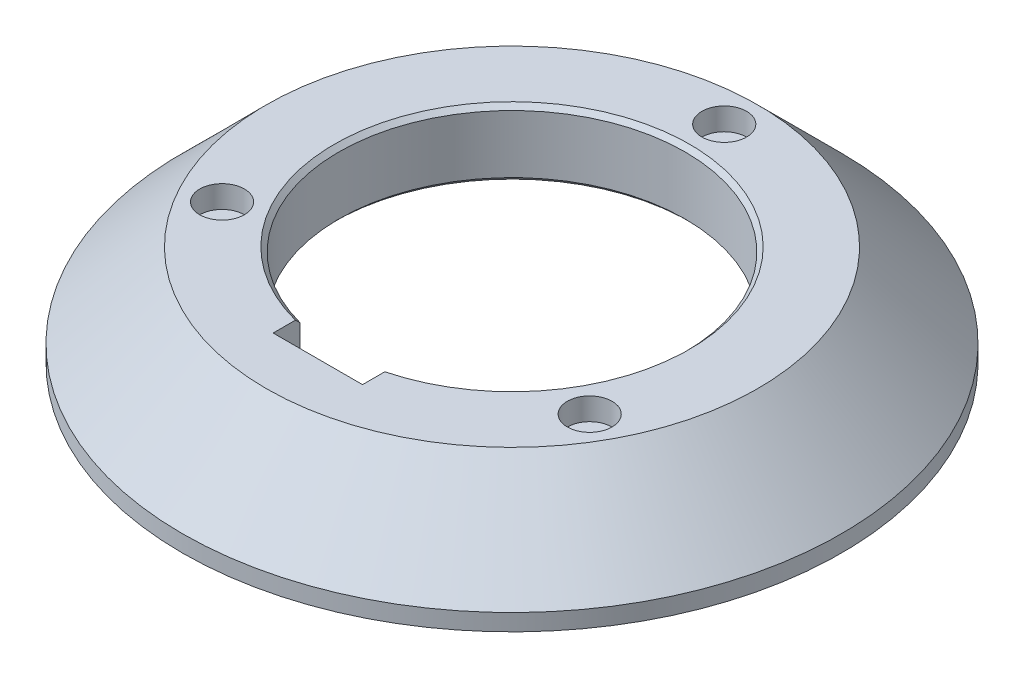
ISO-10303-21;
HEADER;
FILE_DESCRIPTION(('STEP AP214'),'2;1');
FILE_NAME('part.step','',(''),(''),'','','');
FILE_SCHEMA(('AUTOMOTIVE_DESIGN { 1 0 10303 214 1 1 1 1 }'));
ENDSEC;
DATA;
#1=APPLICATION_CONTEXT('core data for automotive mechanical design processes');
#2=APPLICATION_PROTOCOL_DEFINITION('international standard','automotive_design',2000,#1);
#3=PRODUCT_CONTEXT('',#1,'mechanical');
#4=PRODUCT('Part','Part','',(#3));
#5=PRODUCT_RELATED_PRODUCT_CATEGORY('part','',(#4));
#6=PRODUCT_DEFINITION_FORMATION('','',#4);
#7=PRODUCT_DEFINITION_CONTEXT('part definition',#1,'design');
#8=PRODUCT_DEFINITION('design','',#6,#7);
#9=PRODUCT_DEFINITION_SHAPE('','',#8);
#10=(LENGTH_UNIT() NAMED_UNIT(*) SI_UNIT(.MILLI.,.METRE.));
#11=(NAMED_UNIT(*) PLANE_ANGLE_UNIT() SI_UNIT($,.RADIAN.));
#12=(NAMED_UNIT(*) SI_UNIT($,.STERADIAN.) SOLID_ANGLE_UNIT());
#13=UNCERTAINTY_MEASURE_WITH_UNIT(LENGTH_MEASURE(1.E-05),#10,'distance_accuracy_value','');
#14=(GEOMETRIC_REPRESENTATION_CONTEXT(3) GLOBAL_UNCERTAINTY_ASSIGNED_CONTEXT((#13)) GLOBAL_UNIT_ASSIGNED_CONTEXT((#10,
#11,#12)) REPRESENTATION_CONTEXT('',''));
#15=CARTESIAN_POINT('',(0.,0.,0.));
#16=DIRECTION('',(0.,0.,1.));
#17=DIRECTION('',(1.,0.,0.));
#18=AXIS2_PLACEMENT_3D('',#15,#16,#17);
#19=CARTESIAN_POINT('',(110.,30.,0.));
#20=DIRECTION('',(0.,-1.,0.));
#21=DIRECTION('',(0.,0.,-1.));
#22=AXIS2_PLACEMENT_3D('',#19,#20,#21);
#23=PLANE('',#22);
#24=CARTESIAN_POINT('',(-82.2724133595215,30.,47.5000000000004));
#25=DIRECTION('',(0.,1.,0.));
#26=DIRECTION('',(0.866025403784436,0.,-0.500000000000004));
#27=AXIS2_PLACEMENT_3D('',#24,#25,#26);
#28=CIRCLE('',#27,10.);
#29=CARTESIAN_POINT('',(-73.6121593216771,30.,42.5000000000003));
#30=VERTEX_POINT('',#29);
#31=EDGE_CURVE('E131',#30,#30,#28,.T.);
#32=ORIENTED_EDGE('',*,*,#31,.F.);
#33=EDGE_LOOP('',(#32));
#34=FACE_BOUND('',#33,.T.);
#35=CARTESIAN_POINT('',(82.2724133595221,30.,47.4999999999992));
#36=DIRECTION('',(0.,1.,0.));
#37=DIRECTION('',(-0.866025403784443,0.,-0.499999999999992));
#38=AXIS2_PLACEMENT_3D('',#35,#36,#37);
#39=CIRCLE('',#38,10.);
#40=CARTESIAN_POINT('',(73.6121593216777,30.,42.4999999999993));
#41=VERTEX_POINT('',#40);
#42=EDGE_CURVE('E116',#41,#41,#39,.T.);
#43=ORIENTED_EDGE('',*,*,#42,.F.);
#44=EDGE_LOOP('',(#43));
#45=FACE_BOUND('',#44,.T.);
#46=CARTESIAN_POINT('',(0.,30.,-95.));
#47=DIRECTION('',(0.,1.,0.));
#48=DIRECTION('',(0.,0.,1.));
#49=AXIS2_PLACEMENT_3D('',#46,#47,#48);
#50=CIRCLE('',#49,10.);
#51=CARTESIAN_POINT('',(0.,30.,-85.));
#52=VERTEX_POINT('',#51);
#53=EDGE_CURVE('E130',#52,#52,#50,.T.);
#54=ORIENTED_EDGE('',*,*,#53,.F.);
#55=EDGE_LOOP('',(#54));
#56=FACE_BOUND('',#55,.T.);
#57=DIRECTION('',(-1.,0.,0.));
#58=VECTOR('',#57,1.);
#59=CARTESIAN_POINT('',(110.,30.,86.9));
#60=LINE('',#59,#58);
#61=CARTESIAN_POINT('',(20.,30.,86.9));
#62=VERTEX_POINT('',#61);
#63=CARTESIAN_POINT('',(-20.,30.,86.9));
#64=VERTEX_POINT('',#63);
#65=EDGE_CURVE('E107',#62,#64,#60,.T.);
#66=ORIENTED_EDGE('',*,*,#65,.T.);
#67=DIRECTION('',(0.,0.,-1.));
#68=VECTOR('',#67,1.);
#69=CARTESIAN_POINT('',(-20.,30.,0.));
#70=LINE('',#69,#68);
#71=CARTESIAN_POINT('',(-19.999999183372,30.0000087539034,76.943165574341));
#72=VERTEX_POINT('',#71);
#73=EDGE_CURVE('E118',#64,#72,#70,.T.);
#74=ORIENTED_EDGE('',*,*,#73,.T.);
#75=CARTESIAN_POINT('',(0.,30.,0.));
#76=DIRECTION('',(0.,-1.,0.));
#77=DIRECTION('',(0.,0.,-1.));
#78=AXIS2_PLACEMENT_3D('',#75,#76,#77);
#79=CIRCLE('',#78,79.5);
#80=CARTESIAN_POINT('',(19.9999991833721,30.0000087539034,76.943165574341));
#81=VERTEX_POINT('',#80);
#82=EDGE_CURVE('E166',#72,#81,#79,.T.);
#83=ORIENTED_EDGE('',*,*,#82,.T.);
#84=DIRECTION('',(0.,0.,1.));
#85=VECTOR('',#84,1.);
#86=CARTESIAN_POINT('',(20.,30.,0.));
#87=LINE('',#86,#85);
#88=EDGE_CURVE('E54',#81,#62,#87,.T.);
#89=ORIENTED_EDGE('',*,*,#88,.T.);
#90=EDGE_LOOP('',(#66,#74,#83,#89));
#91=FACE_BOUND('',#90,.T.);
#92=CARTESIAN_POINT('',(0.,30.,0.));
#93=DIRECTION('',(0.,1.,0.));
#94=DIRECTION('',(0.,0.,1.));
#95=AXIS2_PLACEMENT_3D('',#92,#93,#94);
#96=CIRCLE('',#95,110.);
#97=CARTESIAN_POINT('',(0.,30.,110.));
#98=VERTEX_POINT('',#97);
#99=EDGE_CURVE('E142',#98,#98,#96,.T.);
#100=ORIENTED_EDGE('',*,*,#99,.T.);
#101=EDGE_LOOP('',(#100));
#102=FACE_BOUND('',#101,.T.);
#103=ADVANCED_FACE('F37',(#34,#45,#56,#91,#102),#23,.F.);
#104=CARTESIAN_POINT('',(0.,107.750556792873,0.));
#105=DIRECTION('',(0.,1.,0.));
#106=DIRECTION('',(0.,0.,1.));
#107=AXIS2_PLACEMENT_3D('',#104,#105,#106);
#108=CYLINDRICAL_SURFACE('',#107,77.5);
#109=CARTESIAN_POINT('',(0.,28.,0.));
#110=DIRECTION('',(0.,-1.,0.));
#111=DIRECTION('',(0.,0.,-1.));
#112=AXIS2_PLACEMENT_3D('',#109,#110,#111);
#113=CIRCLE('',#112,77.5);
#114=CARTESIAN_POINT('',(20.,28.,74.8748956593597));
#115=VERTEX_POINT('',#114);
#116=CARTESIAN_POINT('',(-20.,28.,74.8748956593597));
#117=VERTEX_POINT('',#116);
#118=EDGE_CURVE('E160',#115,#117,#113,.F.);
#119=ORIENTED_EDGE('',*,*,#118,.T.);
#120=DIRECTION('',(0.,1.,0.));
#121=VECTOR('',#120,1.);
#122=CARTESIAN_POINT('',(-20.,107.750556792873,74.8748956593597));
#123=LINE('',#122,#121);
#124=CARTESIAN_POINT('',(-20.,2.00000000000003,74.8748956593597));
#125=VERTEX_POINT('',#124);
#126=EDGE_CURVE('E101',#117,#125,#123,.F.);
#127=ORIENTED_EDGE('',*,*,#126,.T.);
#128=CARTESIAN_POINT('',(0.,2.00000000000003,0.));
#129=DIRECTION('',(0.,1.,0.));
#130=DIRECTION('',(0.,0.,1.));
#131=AXIS2_PLACEMENT_3D('',#128,#129,#130);
#132=CIRCLE('',#131,77.5);
#133=CARTESIAN_POINT('',(20.,2.00000000000003,74.8748956593597));
#134=VERTEX_POINT('',#133);
#135=EDGE_CURVE('E163',#125,#134,#132,.F.);
#136=ORIENTED_EDGE('',*,*,#135,.T.);
#137=DIRECTION('',(0.,1.,0.));
#138=VECTOR('',#137,1.);
#139=CARTESIAN_POINT('',(20.,107.750556792873,74.8748956593597));
#140=LINE('',#139,#138);
#141=EDGE_CURVE('E108',#134,#115,#140,.T.);
#142=ORIENTED_EDGE('',*,*,#141,.T.);
#143=EDGE_LOOP('',(#119,#127,#136,#142));
#144=FACE_BOUND('',#143,.T.);
#145=ADVANCED_FACE('F206',(#144),#108,.F.);
#146=CARTESIAN_POINT('',(77.5,0.,0.));
#147=DIRECTION('',(0.,1.,0.));
#148=DIRECTION('',(0.,0.,1.));
#149=AXIS2_PLACEMENT_3D('',#146,#147,#148);
#150=PLANE('',#149);
#151=CARTESIAN_POINT('',(0.,0.,0.));
#152=DIRECTION('',(0.,1.,0.));
#153=DIRECTION('',(0.,0.,1.));
#154=AXIS2_PLACEMENT_3D('',#151,#152,#153);
#155=CIRCLE('',#154,79.5);
#156=CARTESIAN_POINT('',(20.,0.,76.9431608396744));
#157=VERTEX_POINT('',#156);
#158=CARTESIAN_POINT('',(-20.,0.,76.9431608396744));
#159=VERTEX_POINT('',#158);
#160=EDGE_CURVE('E113',#157,#159,#155,.T.);
#161=ORIENTED_EDGE('',*,*,#160,.T.);
#162=DIRECTION('',(0.,0.,1.));
#163=VECTOR('',#162,1.);
#164=CARTESIAN_POINT('',(-20.,0.,0.));
#165=LINE('',#164,#163);
#166=CARTESIAN_POINT('',(-20.,0.,86.9));
#167=VERTEX_POINT('',#166);
#168=EDGE_CURVE('E62',#159,#167,#165,.T.);
#169=ORIENTED_EDGE('',*,*,#168,.T.);
#170=DIRECTION('',(1.,0.,0.));
#171=VECTOR('',#170,1.);
#172=CARTESIAN_POINT('',(77.5,0.,86.9));
#173=LINE('',#172,#171);
#174=CARTESIAN_POINT('',(20.,0.,86.9));
#175=VERTEX_POINT('',#174);
#176=EDGE_CURVE('E11',#167,#175,#173,.T.);
#177=ORIENTED_EDGE('',*,*,#176,.T.);
#178=DIRECTION('',(0.,0.,-1.));
#179=VECTOR('',#178,1.);
#180=CARTESIAN_POINT('',(20.,0.,0.));
#181=LINE('',#180,#179);
#182=EDGE_CURVE('E92',#175,#157,#181,.T.);
#183=ORIENTED_EDGE('',*,*,#182,.T.);
#184=EDGE_LOOP('',(#161,#169,#177,#183));
#185=FACE_BOUND('',#184,.T.);
#186=CARTESIAN_POINT('',(0.,0.,0.));
#187=DIRECTION('',(0.,1.,0.));
#188=DIRECTION('',(0.,0.,1.));
#189=AXIS2_PLACEMENT_3D('',#186,#187,#188);
#190=CIRCLE('',#189,117.5);
#191=CARTESIAN_POINT('',(0.,0.,117.5));
#192=VERTEX_POINT('',#191);
#193=EDGE_CURVE('E156',#192,#192,#190,.T.);
#194=ORIENTED_EDGE('',*,*,#193,.F.);
#195=EDGE_LOOP('',(#194));
#196=FACE_BOUND('',#195,.T.);
#197=ADVANCED_FACE('F111',(#185,#196),#150,.F.);
#198=CARTESIAN_POINT('',(0.,0.,0.));
#199=DIRECTION('',(0.,-1.,0.));
#200=DIRECTION('',(0.,0.,-1.));
#201=AXIS2_PLACEMENT_3D('',#198,#199,#200);
#202=CONICAL_SURFACE('',#201,117.5,0.785398163397447);
#203=CARTESIAN_POINT('',(0.,-15.,0.));
#204=DIRECTION('',(0.,1.,0.));
#205=DIRECTION('',(0.,0.,1.));
#206=AXIS2_PLACEMENT_3D('',#203,#204,#205);
#207=CIRCLE('',#206,132.5);
#208=CARTESIAN_POINT('',(0.,-15.,132.5));
#209=VERTEX_POINT('',#208);
#210=EDGE_CURVE('E153',#209,#209,#207,.T.);
#211=ORIENTED_EDGE('',*,*,#210,.F.);
#212=EDGE_LOOP('',(#211));
#213=FACE_BOUND('',#212,.T.);
#214=ORIENTED_EDGE('',*,*,#193,.T.);
#215=EDGE_LOOP('',(#214));
#216=FACE_BOUND('',#215,.T.);
#217=ADVANCED_FACE('F213',(#213,#216),#202,.F.);
#218=CARTESIAN_POINT('',(132.5,-15.,0.));
#219=DIRECTION('',(0.,1.,0.));
#220=DIRECTION('',(0.,0.,1.));
#221=AXIS2_PLACEMENT_3D('',#218,#219,#220);
#222=PLANE('',#221);
#223=CARTESIAN_POINT('',(0.,-15.,0.));
#224=DIRECTION('',(0.,1.,0.));
#225=DIRECTION('',(0.,0.,1.));
#226=AXIS2_PLACEMENT_3D('',#223,#224,#225);
#227=CIRCLE('',#226,147.5);
#228=CARTESIAN_POINT('',(0.,-15.,147.5));
#229=VERTEX_POINT('',#228);
#230=EDGE_CURVE('E150',#229,#229,#227,.T.);
#231=ORIENTED_EDGE('',*,*,#230,.F.);
#232=EDGE_LOOP('',(#231));
#233=FACE_BOUND('',#232,.T.);
#234=ORIENTED_EDGE('',*,*,#210,.T.);
#235=EDGE_LOOP('',(#234));
#236=FACE_BOUND('',#235,.T.);
#237=ADVANCED_FACE('F216',(#233,#236),#222,.F.);
#238=CARTESIAN_POINT('',(0.,107.750556792873,0.));
#239=DIRECTION('',(0.,1.,0.));
#240=DIRECTION('',(0.,0.,1.));
#241=AXIS2_PLACEMENT_3D('',#238,#239,#240);
#242=CYLINDRICAL_SURFACE('',#241,147.5);
#243=CARTESIAN_POINT('',(0.,-7.5000000000001,0.));
#244=DIRECTION('',(0.,1.,0.));
#245=DIRECTION('',(0.,0.,1.));
#246=AXIS2_PLACEMENT_3D('',#243,#244,#245);
#247=CIRCLE('',#246,147.5);
#248=CARTESIAN_POINT('',(0.,-7.5000000000001,147.5));
#249=VERTEX_POINT('',#248);
#250=EDGE_CURVE('E147',#249,#249,#247,.T.);
#251=ORIENTED_EDGE('',*,*,#250,.F.);
#252=EDGE_LOOP('',(#251));
#253=FACE_BOUND('',#252,.T.);
#254=ORIENTED_EDGE('',*,*,#230,.T.);
#255=EDGE_LOOP('',(#254));
#256=FACE_BOUND('',#255,.T.);
#257=ADVANCED_FACE('F220',(#253,#256),#242,.T.);
#258=CARTESIAN_POINT('',(0.,-7.5000000000001,0.));
#259=DIRECTION('',(0.,-1.,0.));
#260=DIRECTION('',(0.,0.,-1.));
#261=AXIS2_PLACEMENT_3D('',#258,#259,#260);
#262=CONICAL_SURFACE('',#261,147.5,0.785398163397447);
#263=ORIENTED_EDGE('',*,*,#99,.F.);
#264=EDGE_LOOP('',(#263));
#265=FACE_BOUND('',#264,.T.);
#266=ORIENTED_EDGE('',*,*,#250,.T.);
#267=EDGE_LOOP('',(#266));
#268=FACE_BOUND('',#267,.T.);
#269=ADVANCED_FACE('F201',(#265,#268),#262,.T.);
#270=CARTESIAN_POINT('',(0.,0.,0.));
#271=DIRECTION('',(0.,-1.,0.));
#272=DIRECTION('',(0.,0.,-1.));
#273=AXIS2_PLACEMENT_3D('',#270,#271,#272);
#274=CONICAL_SURFACE('',#273,79.5,0.785398163397441);
#275=CARTESIAN_POINT('',(-20.,-17.5684312119772,94.9856849106975));
#276=CARTESIAN_POINT('',(-20.,-16.0097924913469,93.3928472974872));
#277=CARTESIAN_POINT('',(-20.,-14.4519817757735,91.7991986225075));
#278=CARTESIAN_POINT('',(-20.,-11.3383457901811,88.6099617932942));
#279=CARTESIAN_POINT('',(-20.,-9.78252052094745,87.0143736382942));
#280=CARTESIAN_POINT('',(-20.,-6.67321620346296,83.8209726736292));
#281=CARTESIAN_POINT('',(-20.,-5.11973711035972,82.2231599076445));
#282=CARTESIAN_POINT('',(-20.,-2.01552747081061,79.02486686309));
#283=CARTESIAN_POINT('',(-20.,-0.4647969237774,77.4243865850903));
#284=CARTESIAN_POINT('',(-20.,2.63339750207828,74.2202237529315));
#285=CARTESIAN_POINT('',(-20.,4.18086133553764,72.6165411548974));
#286=CARTESIAN_POINT('',(-20.,7.271804411606,69.4053439372526));
#287=CARTESIAN_POINT('',(-20.,8.81528365975796,67.7978293229788));
#288=CARTESIAN_POINT('',(-20.,11.8973897349149,64.5780925799859));
#289=CARTESIAN_POINT('',(-20.,13.4360164677237,62.9658703610395));
#290=CARTESIAN_POINT('',(-20.,15.7393910224165,60.5431891470597));
#291=CARTESIAN_POINT('',(-20.,16.5064234991292,59.7349020997113));
#292=CARTESIAN_POINT('',(-20.,18.0387677175682,58.1166970803101));
#293=CARTESIAN_POINT('',(-20.,18.8040794574747,57.3067791065341));
#294=CARTESIAN_POINT('',(-20.,19.5684312119773,56.49595505338));
#295=B_SPLINE_CURVE_WITH_KNOTS('',3,(#275,#276,#277,#278,#279,#280,#281,#282,#283,#284,#285,
#286,#287,#288,#289,#290,#291,#292,#293,#294),.UNSPECIFIED.,.F.,.F.,(4,2,2,2,2,2,2,2,2,4),(0.,
6.68568506223245,13.3713727677386,20.0569310011246,26.742487805724,33.4281368463093,
40.1137765814846,46.7995453080812,50.1424461297198,53.4853504850127),.UNSPECIFIED.);
#296=EDGE_CURVE('E114',#159,#125,#295,.T.);
#297=ORIENTED_EDGE('',*,*,#296,.F.);
#298=ORIENTED_EDGE('',*,*,#160,.F.);
#299=CARTESIAN_POINT('',(20.,19.5684312119773,56.49595505338));
#300=CARTESIAN_POINT('',(20.,18.8040794574747,57.3067791065341));
#301=CARTESIAN_POINT('',(20.,18.0387677175682,58.11669708031));
#302=CARTESIAN_POINT('',(20.,16.5064234991293,59.7349020997113));
#303=CARTESIAN_POINT('',(20.,15.7393910224165,60.5431891470597));
#304=CARTESIAN_POINT('',(20.,13.4360164677237,62.9658703610395));
#305=CARTESIAN_POINT('',(20.,11.8973897349149,64.5780925799859));
#306=CARTESIAN_POINT('',(20.,8.81528365975795,67.7978293229788));
#307=CARTESIAN_POINT('',(20.,7.27180441160599,69.4053439372526));
#308=CARTESIAN_POINT('',(20.,4.18086133553762,72.6165411548974));
#309=CARTESIAN_POINT('',(20.,2.63339750207826,74.2202237529315));
#310=CARTESIAN_POINT('',(20.,-0.464796923777415,77.4243865850904));
#311=CARTESIAN_POINT('',(20.,-2.01552747081062,79.02486686309));
#312=CARTESIAN_POINT('',(20.,-5.11973711035974,82.2231599076445));
#313=CARTESIAN_POINT('',(20.,-6.67321620346298,83.8209726736293));
#314=CARTESIAN_POINT('',(20.,-9.78252052094747,87.0143736382942));
#315=CARTESIAN_POINT('',(20.,-11.3383457901812,88.6099617932942));
#316=CARTESIAN_POINT('',(20.,-14.4519817757735,91.7991986225075));
#317=CARTESIAN_POINT('',(20.,-16.0097924913469,93.3928472974872));
#318=CARTESIAN_POINT('',(20.,-17.5684312119773,94.9856849106975));
#319=B_SPLINE_CURVE_WITH_KNOTS('',3,(#299,#300,#301,#302,#303,#304,#305,#306,#307,#308,#309,
#310,#311,#312,#313,#314,#315,#316,#317,#318),.UNSPECIFIED.,.F.,.F.,(4,2,2,2,2,2,2,2,2,4),(0.,
3.34290435529286,6.68580517693152,13.3715739035281,20.0572136387034,26.7428626792887,
33.4284194838881,40.1139777172742,46.7996654227803,53.4853504850127),.UNSPECIFIED.);
#320=EDGE_CURVE('E97',#134,#157,#319,.T.);
#321=ORIENTED_EDGE('',*,*,#320,.F.);
#322=ORIENTED_EDGE('',*,*,#135,.F.);
#323=EDGE_LOOP('',(#297,#298,#321,#322));
#324=FACE_BOUND('',#323,.T.);
#325=ADVANCED_FACE('F195',(#324),#274,.F.);
#326=CARTESIAN_POINT('',(0.,28.,0.));
#327=DIRECTION('',(0.,1.,0.));
#328=DIRECTION('',(0.,0.,1.));
#329=AXIS2_PLACEMENT_3D('',#326,#327,#328);
#330=CONICAL_SURFACE('',#329,77.5,0.785398163397438);
#331=CARTESIAN_POINT('',(-20.,10.4315687880228,56.4959550533802));
#332=CARTESIAN_POINT('',(-20.,11.1959205425254,57.3067791065343));
#333=CARTESIAN_POINT('',(-20.,11.9612322824319,58.1166970803102));
#334=CARTESIAN_POINT('',(-20.,13.4935765008708,59.7349020997115));
#335=CARTESIAN_POINT('',(-20.,14.2606089775835,60.5431891470599));
#336=CARTESIAN_POINT('',(-20.,16.5639835322763,62.9658703610396));
#337=CARTESIAN_POINT('',(-20.,18.1026102650851,64.578092579986));
#338=CARTESIAN_POINT('',(-20.,21.1847163402421,67.7978293229788));
#339=CARTESIAN_POINT('',(-20.,22.7281955883941,69.4053439372527));
#340=CARTESIAN_POINT('',(-20.,25.8191386644624,72.6165411548974));
#341=CARTESIAN_POINT('',(-20.,27.3666024979218,74.2202237529315));
#342=CARTESIAN_POINT('',(-20.,30.4647969237774,77.4243865850903));
#343=CARTESIAN_POINT('',(-20.,32.0155274708106,79.0248668630899));
#344=CARTESIAN_POINT('',(-20.,35.1197371103597,82.2231599076444));
#345=CARTESIAN_POINT('',(-20.,36.673216203463,83.8209726736291));
#346=CARTESIAN_POINT('',(-20.,39.7825205209474,87.014373638294));
#347=CARTESIAN_POINT('',(-20.,41.3383457901811,88.6099617932941));
#348=CARTESIAN_POINT('',(-20.,44.4519817757734,91.7991986225073));
#349=CARTESIAN_POINT('',(-20.,46.0097924913468,93.392847297487));
#350=CARTESIAN_POINT('',(-20.,47.5684312119772,94.9856849106973));
#351=B_SPLINE_CURVE_WITH_KNOTS('',3,(#331,#332,#333,#334,#335,#336,#337,#338,#339,#340,#341,
#342,#343,#344,#345,#346,#347,#348,#349,#350),.UNSPECIFIED.,.F.,.F.,(4,2,2,2,2,2,2,2,2,4),(0.,
3.34290435529283,6.68580517693147,13.371573903528,20.0572136387032,26.7428626792885,
33.4284194838878,40.1139777172738,46.7996654227799,53.4853504850123),.UNSPECIFIED.);
#352=EDGE_CURVE('E47',#117,#72,#351,.T.);
#353=ORIENTED_EDGE('',*,*,#352,.F.);
#354=ORIENTED_EDGE('',*,*,#118,.F.);
#355=CARTESIAN_POINT('',(20.,47.5684312119772,94.9856849106973));
#356=CARTESIAN_POINT('',(20.,46.0097924913468,93.392847297487));
#357=CARTESIAN_POINT('',(20.,44.4519817757734,91.7991986225073));
#358=CARTESIAN_POINT('',(20.,41.3383457901811,88.6099617932941));
#359=CARTESIAN_POINT('',(20.,39.7825205209474,87.014373638294));
#360=CARTESIAN_POINT('',(20.,36.673216203463,83.8209726736291));
#361=CARTESIAN_POINT('',(20.,35.1197371103597,82.2231599076444));
#362=CARTESIAN_POINT('',(20.,32.0155274708106,79.0248668630899));
#363=CARTESIAN_POINT('',(20.,30.4647969237774,77.4243865850903));
#364=CARTESIAN_POINT('',(20.,27.3666024979218,74.2202237529315));
#365=CARTESIAN_POINT('',(20.,25.8191386644624,72.6165411548974));
#366=CARTESIAN_POINT('',(20.,22.7281955883941,69.4053439372527));
#367=CARTESIAN_POINT('',(20.,21.1847163402421,67.7978293229788));
#368=CARTESIAN_POINT('',(20.,18.1026102650851,64.578092579986));
#369=CARTESIAN_POINT('',(20.,16.5639835322763,62.9658703610396));
#370=CARTESIAN_POINT('',(20.,14.2606089775835,60.5431891470599));
#371=CARTESIAN_POINT('',(20.,13.4935765008708,59.7349020997115));
#372=CARTESIAN_POINT('',(20.,11.9612322824319,58.1166970803102));
#373=CARTESIAN_POINT('',(20.,11.1959205425254,57.3067791065343));
#374=CARTESIAN_POINT('',(20.,10.4315687880228,56.4959550533802));
#375=B_SPLINE_CURVE_WITH_KNOTS('',3,(#355,#356,#357,#358,#359,#360,#361,#362,#363,#364,#365,
#366,#367,#368,#369,#370,#371,#372,#373,#374),.UNSPECIFIED.,.F.,.F.,(4,2,2,2,2,2,2,2,2,4),(0.,
6.68568506223239,13.3713727677384,20.0569310011245,26.7424878057238,33.4281368463091,
40.1137765814843,46.7995453080808,50.1424461297195,53.4853504850123),.UNSPECIFIED.);
#376=EDGE_CURVE('E171',#81,#115,#375,.T.);
#377=ORIENTED_EDGE('',*,*,#376,.F.);
#378=ORIENTED_EDGE('',*,*,#82,.F.);
#379=EDGE_LOOP('',(#353,#354,#377,#378));
#380=FACE_BOUND('',#379,.T.);
#381=ADVANCED_FACE('F40',(#380),#330,.F.);
#382=CARTESIAN_POINT('',(0.,20.,-95.));
#383=DIRECTION('',(0.,1.,0.));
#384=DIRECTION('',(0.,0.,1.));
#385=AXIS2_PLACEMENT_3D('',#382,#383,#384);
#386=CYLINDRICAL_SURFACE('',#385,10.);
#387=CARTESIAN_POINT('',(0.,20.,-95.));
#388=DIRECTION('',(0.,1.,0.));
#389=DIRECTION('',(0.,0.,1.));
#390=AXIS2_PLACEMENT_3D('',#387,#388,#389);
#391=CIRCLE('',#390,10.);
#392=CARTESIAN_POINT('',(0.,20.,-85.));
#393=VERTEX_POINT('',#392);
#394=EDGE_CURVE('E139',#393,#393,#391,.T.);
#395=ORIENTED_EDGE('',*,*,#394,.F.);
#396=EDGE_LOOP('',(#395));
#397=FACE_BOUND('',#396,.T.);
#398=ORIENTED_EDGE('',*,*,#53,.T.);
#399=EDGE_LOOP('',(#398));
#400=FACE_BOUND('',#399,.T.);
#401=ADVANCED_FACE('F228',(#397,#400),#386,.F.);
#402=CARTESIAN_POINT('',(0.,20.,-95.));
#403=DIRECTION('',(0.,1.,0.));
#404=DIRECTION('',(0.,0.,1.));
#405=AXIS2_PLACEMENT_3D('',#402,#403,#404);
#406=PLANE('',#405);
#407=ORIENTED_EDGE('',*,*,#394,.T.);
#408=EDGE_LOOP('',(#407));
#409=FACE_BOUND('',#408,.T.);
#410=ADVANCED_FACE('F231',(#409),#406,.T.);
#411=CARTESIAN_POINT('',(82.2724133595221,20.,47.4999999999992));
#412=DIRECTION('',(0.,1.,0.));
#413=DIRECTION('',(0.,0.,1.));
#414=AXIS2_PLACEMENT_3D('',#411,#412,#413);
#415=CYLINDRICAL_SURFACE('',#414,10.);
#416=CARTESIAN_POINT('',(82.2724133595221,20.,47.4999999999992));
#417=DIRECTION('',(0.,1.,0.));
#418=DIRECTION('',(-0.866025403784443,0.,-0.499999999999992));
#419=AXIS2_PLACEMENT_3D('',#416,#417,#418);
#420=CIRCLE('',#419,10.);
#421=CARTESIAN_POINT('',(73.6121593216777,20.,42.4999999999993));
#422=VERTEX_POINT('',#421);
#423=EDGE_CURVE('E134',#422,#422,#420,.T.);
#424=ORIENTED_EDGE('',*,*,#423,.F.);
#425=EDGE_LOOP('',(#424));
#426=FACE_BOUND('',#425,.T.);
#427=ORIENTED_EDGE('',*,*,#42,.T.);
#428=EDGE_LOOP('',(#427));
#429=FACE_BOUND('',#428,.T.);
#430=ADVANCED_FACE('F235',(#426,#429),#415,.F.);
#431=CARTESIAN_POINT('',(82.2724133595221,20.,47.4999999999992));
#432=DIRECTION('',(0.,1.,0.));
#433=DIRECTION('',(-0.866025403784443,0.,-0.499999999999992));
#434=AXIS2_PLACEMENT_3D('',#431,#432,#433);
#435=PLANE('',#434);
#436=ORIENTED_EDGE('',*,*,#423,.T.);
#437=EDGE_LOOP('',(#436));
#438=FACE_BOUND('',#437,.T.);
#439=ADVANCED_FACE('F239',(#438),#435,.T.);
#440=CARTESIAN_POINT('',(-82.2724133595215,20.,47.5000000000004));
#441=DIRECTION('',(0.,1.,0.));
#442=DIRECTION('',(0.,0.,1.));
#443=AXIS2_PLACEMENT_3D('',#440,#441,#442);
#444=CYLINDRICAL_SURFACE('',#443,10.);
#445=CARTESIAN_POINT('',(-82.2724133595215,20.,47.5000000000004));
#446=DIRECTION('',(0.,1.,0.));
#447=DIRECTION('',(0.866025403784436,0.,-0.500000000000004));
#448=AXIS2_PLACEMENT_3D('',#445,#446,#447);
#449=CIRCLE('',#448,10.);
#450=CARTESIAN_POINT('',(-73.6121593216771,20.,42.5000000000003));
#451=VERTEX_POINT('',#450);
#452=EDGE_CURVE('E127',#451,#451,#449,.T.);
#453=ORIENTED_EDGE('',*,*,#452,.F.);
#454=EDGE_LOOP('',(#453));
#455=FACE_BOUND('',#454,.T.);
#456=ORIENTED_EDGE('',*,*,#31,.T.);
#457=EDGE_LOOP('',(#456));
#458=FACE_BOUND('',#457,.T.);
#459=ADVANCED_FACE('F243',(#455,#458),#444,.F.);
#460=CARTESIAN_POINT('',(-82.2724133595215,20.,47.5000000000004));
#461=DIRECTION('',(0.,1.,0.));
#462=DIRECTION('',(0.866025403784436,0.,-0.500000000000004));
#463=AXIS2_PLACEMENT_3D('',#460,#461,#462);
#464=PLANE('',#463);
#465=ORIENTED_EDGE('',*,*,#452,.T.);
#466=EDGE_LOOP('',(#465));
#467=FACE_BOUND('',#466,.T.);
#468=ADVANCED_FACE('F247',(#467),#464,.T.);
#469=CARTESIAN_POINT('',(-20.,-15.,86.9));
#470=DIRECTION('',(0.,0.,1.));
#471=DIRECTION('',(1.,0.,0.));
#472=AXIS2_PLACEMENT_3D('',#469,#470,#471);
#473=PLANE('',#472);
#474=DIRECTION('',(0.,1.,0.));
#475=VECTOR('',#474,1.);
#476=CARTESIAN_POINT('',(20.,-15.,86.9));
#477=LINE('',#476,#475);
#478=EDGE_CURVE('E95',#175,#62,#477,.T.);
#479=ORIENTED_EDGE('',*,*,#478,.F.);
#480=ORIENTED_EDGE('',*,*,#176,.F.);
#481=DIRECTION('',(0.,1.,0.));
#482=VECTOR('',#481,1.);
#483=CARTESIAN_POINT('',(-20.,-15.,86.9));
#484=LINE('',#483,#482);
#485=EDGE_CURVE('E109',#167,#64,#484,.T.);
#486=ORIENTED_EDGE('',*,*,#485,.T.);
#487=ORIENTED_EDGE('',*,*,#65,.F.);
#488=EDGE_LOOP('',(#479,#480,#486,#487));
#489=FACE_BOUND('',#488,.T.);
#490=ADVANCED_FACE('F104',(#489),#473,.F.);
#491=CARTESIAN_POINT('',(-20.,-15.,62.0459818976406));
#492=DIRECTION('',(-1.,0.,0.));
#493=DIRECTION('',(0.,0.,1.));
#494=AXIS2_PLACEMENT_3D('',#491,#492,#493);
#495=PLANE('',#494);
#496=ORIENTED_EDGE('',*,*,#296,.T.);
#497=ORIENTED_EDGE('',*,*,#126,.F.);
#498=ORIENTED_EDGE('',*,*,#352,.T.);
#499=ORIENTED_EDGE('',*,*,#73,.F.);
#500=ORIENTED_EDGE('',*,*,#485,.F.);
#501=ORIENTED_EDGE('',*,*,#168,.F.);
#502=EDGE_LOOP('',(#496,#497,#498,#499,#500,#501));
#503=FACE_BOUND('',#502,.T.);
#504=ADVANCED_FACE('F183',(#503),#495,.F.);
#505=CARTESIAN_POINT('',(20.,-15.,86.9));
#506=DIRECTION('',(1.,0.,0.));
#507=DIRECTION('',(0.,0.,-1.));
#508=AXIS2_PLACEMENT_3D('',#505,#506,#507);
#509=PLANE('',#508);
#510=ORIENTED_EDGE('',*,*,#478,.T.);
#511=ORIENTED_EDGE('',*,*,#88,.F.);
#512=ORIENTED_EDGE('',*,*,#376,.T.);
#513=ORIENTED_EDGE('',*,*,#141,.F.);
#514=ORIENTED_EDGE('',*,*,#320,.T.);
#515=ORIENTED_EDGE('',*,*,#182,.F.);
#516=EDGE_LOOP('',(#510,#511,#512,#513,#514,#515));
#517=FACE_BOUND('',#516,.T.);
#518=ADVANCED_FACE('F94',(#517),#509,.F.);
#519=CLOSED_SHELL('',(#103,#145,#197,#217,#237,#257,#269,#325,#381,#401,#410,#430,#439,#459,
#468,#490,#504,#518));
#520=MANIFOLD_SOLID_BREP('B2',#519);
#521=ADVANCED_BREP_SHAPE_REPRESENTATION('',(#18,#520),#14);
#522=SHAPE_DEFINITION_REPRESENTATION(#9,#521);
ENDSEC;
END-ISO-10303-21;
